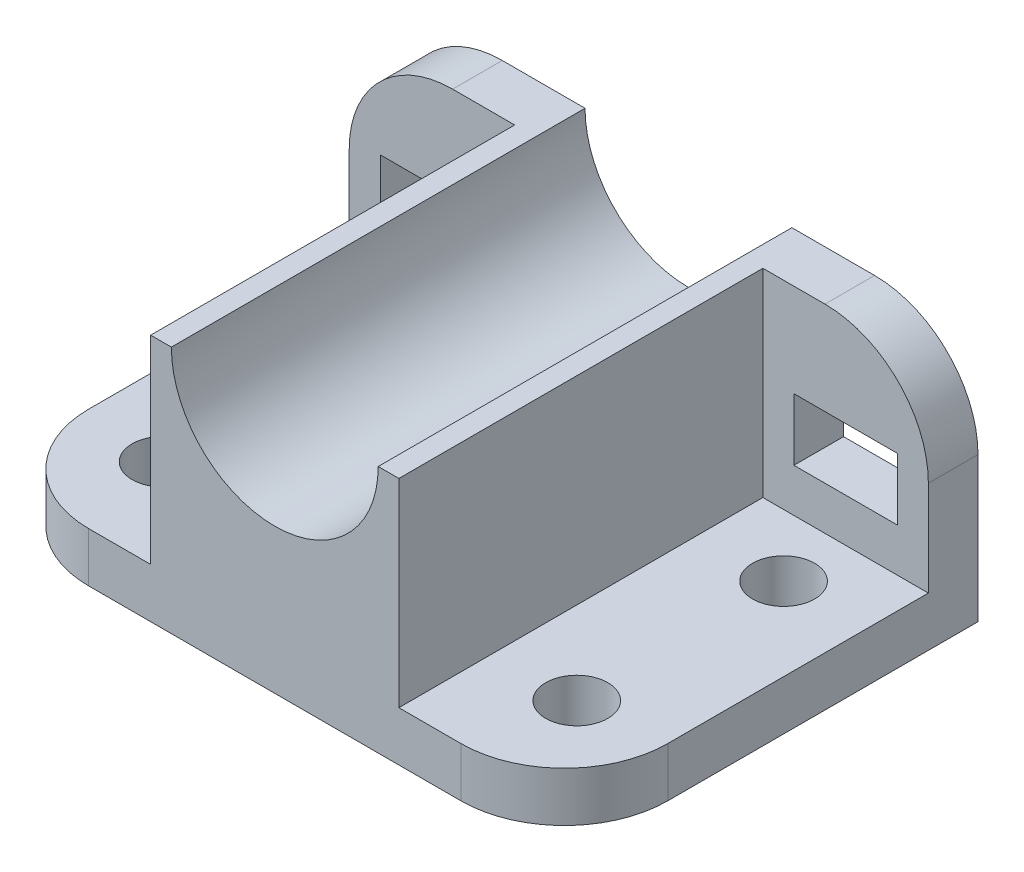
ISO-10303-21;
HEADER;
FILE_DESCRIPTION(('STEP AP214'),'2;1');
FILE_NAME('part.step','',(''),(''),'','','');
FILE_SCHEMA(('AUTOMOTIVE_DESIGN { 1 0 10303 214 1 1 1 1 }'));
ENDSEC;
DATA;
#1=APPLICATION_CONTEXT('core data for automotive mechanical design processes');
#2=APPLICATION_PROTOCOL_DEFINITION('international standard','automotive_design',2000,#1);
#3=PRODUCT_CONTEXT('',#1,'mechanical');
#4=PRODUCT('Part','Part','',(#3));
#5=PRODUCT_RELATED_PRODUCT_CATEGORY('part','',(#4));
#6=PRODUCT_DEFINITION_FORMATION('','',#4);
#7=PRODUCT_DEFINITION_CONTEXT('part definition',#1,'design');
#8=PRODUCT_DEFINITION('design','',#6,#7);
#9=PRODUCT_DEFINITION_SHAPE('','',#8);
#10=(LENGTH_UNIT() NAMED_UNIT(*) SI_UNIT(.MILLI.,.METRE.));
#11=(NAMED_UNIT(*) PLANE_ANGLE_UNIT() SI_UNIT($,.RADIAN.));
#12=(NAMED_UNIT(*) SI_UNIT($,.STERADIAN.) SOLID_ANGLE_UNIT());
#13=UNCERTAINTY_MEASURE_WITH_UNIT(LENGTH_MEASURE(1.E-05),#10,'distance_accuracy_value','');
#14=(GEOMETRIC_REPRESENTATION_CONTEXT(3) GLOBAL_UNCERTAINTY_ASSIGNED_CONTEXT((#13)) GLOBAL_UNIT_ASSIGNED_CONTEXT((#10,
#11,#12)) REPRESENTATION_CONTEXT('',''));
#15=CARTESIAN_POINT('',(0.,0.,0.));
#16=DIRECTION('',(0.,0.,1.));
#17=DIRECTION('',(1.,0.,0.));
#18=AXIS2_PLACEMENT_3D('',#15,#16,#17);
#19=CARTESIAN_POINT('',(0.,60.,100.));
#20=DIRECTION('',(0.,0.,1.));
#21=DIRECTION('',(1.,0.,0.));
#22=AXIS2_PLACEMENT_3D('',#19,#20,#21);
#23=PLANE('',#22);
#24=DIRECTION('',(1.,0.,0.));
#25=VECTOR('',#24,1.);
#26=CARTESIAN_POINT('',(0.,12.,100.));
#27=LINE('',#26,#25);
#28=CARTESIAN_POINT('',(-45.,12.,100.));
#29=VERTEX_POINT('',#28);
#30=CARTESIAN_POINT('',(-30.,12.,100.));
#31=VERTEX_POINT('',#30);
#32=EDGE_CURVE('E372',#29,#31,#27,.T.);
#33=ORIENTED_EDGE('',*,*,#32,.F.);
#34=DIRECTION('',(0.,-1.,0.));
#35=VECTOR('',#34,1.);
#36=CARTESIAN_POINT('',(-45.,0.,100.));
#37=LINE('',#36,#35);
#38=CARTESIAN_POINT('',(-45.,0.,100.));
#39=VERTEX_POINT('',#38);
#40=EDGE_CURVE('E284',#29,#39,#37,.T.);
#41=ORIENTED_EDGE('',*,*,#40,.T.);
#42=DIRECTION('',(1.,0.,0.));
#43=VECTOR('',#42,1.);
#44=CARTESIAN_POINT('',(-70.,0.,100.));
#45=LINE('',#44,#43);
#46=CARTESIAN_POINT('',(45.,0.,100.));
#47=VERTEX_POINT('',#46);
#48=EDGE_CURVE('E247',#39,#47,#45,.T.);
#49=ORIENTED_EDGE('',*,*,#48,.T.);
#50=DIRECTION('',(0.,1.,0.));
#51=VECTOR('',#50,1.);
#52=CARTESIAN_POINT('',(45.,12.,100.));
#53=LINE('',#52,#51);
#54=CARTESIAN_POINT('',(45.,12.,100.));
#55=VERTEX_POINT('',#54);
#56=EDGE_CURVE('E281',#47,#55,#53,.T.);
#57=ORIENTED_EDGE('',*,*,#56,.T.);
#58=DIRECTION('',(-1.,0.,0.));
#59=VECTOR('',#58,1.);
#60=CARTESIAN_POINT('',(0.,12.,100.));
#61=LINE('',#60,#59);
#62=CARTESIAN_POINT('',(30.,12.,100.));
#63=VERTEX_POINT('',#62);
#64=EDGE_CURVE('E399',#55,#63,#61,.T.);
#65=ORIENTED_EDGE('',*,*,#64,.T.);
#66=DIRECTION('',(0.,1.,0.));
#67=VECTOR('',#66,1.);
#68=CARTESIAN_POINT('',(30.,0.,100.));
#69=LINE('',#68,#67);
#70=CARTESIAN_POINT('',(30.,60.,100.));
#71=VERTEX_POINT('',#70);
#72=EDGE_CURVE('E387',#63,#71,#69,.T.);
#73=ORIENTED_EDGE('',*,*,#72,.T.);
#74=DIRECTION('',(-1.,0.,0.));
#75=VECTOR('',#74,1.);
#76=CARTESIAN_POINT('',(70.,60.,100.));
#77=LINE('',#76,#75);
#78=CARTESIAN_POINT('',(25.,60.,100.));
#79=VERTEX_POINT('',#78);
#80=EDGE_CURVE('E250',#71,#79,#77,.T.);
#81=ORIENTED_EDGE('',*,*,#80,.T.);
#82=CARTESIAN_POINT('',(0.,60.,100.));
#83=DIRECTION('',(0.,0.,-1.));
#84=DIRECTION('',(1.,0.,0.));
#85=AXIS2_PLACEMENT_3D('',#82,#83,#84);
#86=CIRCLE('',#85,25.);
#87=CARTESIAN_POINT('',(-25.,60.,100.));
#88=VERTEX_POINT('',#87);
#89=EDGE_CURVE('E253',#79,#88,#86,.T.);
#90=ORIENTED_EDGE('',*,*,#89,.T.);
#91=DIRECTION('',(-1.,0.,0.));
#92=VECTOR('',#91,1.);
#93=CARTESIAN_POINT('',(-25.,60.,100.));
#94=LINE('',#93,#92);
#95=CARTESIAN_POINT('',(-30.,60.,100.));
#96=VERTEX_POINT('',#95);
#97=EDGE_CURVE('E255',#88,#96,#94,.T.);
#98=ORIENTED_EDGE('',*,*,#97,.T.);
#99=DIRECTION('',(0.,1.,0.));
#100=VECTOR('',#99,1.);
#101=CARTESIAN_POINT('',(-30.,0.,100.));
#102=LINE('',#101,#100);
#103=EDGE_CURVE('E204',#31,#96,#102,.T.);
#104=ORIENTED_EDGE('',*,*,#103,.F.);
#105=EDGE_LOOP('',(#33,#41,#49,#57,#65,#73,#81,#90,#98,#104));
#106=FACE_BOUND('',#105,.T.);
#107=ADVANCED_FACE('F33',(#106),#23,.T.);
#108=CARTESIAN_POINT('',(70.,0.,100.));
#109=DIRECTION('',(-1.,0.,0.));
#110=DIRECTION('',(0.,0.,1.));
#111=AXIS2_PLACEMENT_3D('',#108,#109,#110);
#112=PLANE('',#111);
#113=DIRECTION('',(0.,0.,1.));
#114=VECTOR('',#113,1.);
#115=CARTESIAN_POINT('',(70.,12.,12.));
#116=LINE('',#115,#114);
#117=CARTESIAN_POINT('',(70.,12.,12.));
#118=VERTEX_POINT('',#117);
#119=CARTESIAN_POINT('',(70.,12.,75.));
#120=VERTEX_POINT('',#119);
#121=EDGE_CURVE('E398',#118,#120,#116,.T.);
#122=ORIENTED_EDGE('',*,*,#121,.T.);
#123=DIRECTION('',(0.,1.,0.));
#124=VECTOR('',#123,1.);
#125=CARTESIAN_POINT('',(70.,0.,75.));
#126=LINE('',#125,#124);
#127=CARTESIAN_POINT('',(70.,0.,75.));
#128=VERTEX_POINT('',#127);
#129=EDGE_CURVE('E302',#120,#128,#126,.F.);
#130=ORIENTED_EDGE('',*,*,#129,.T.);
#131=DIRECTION('',(0.,0.,-1.));
#132=VECTOR('',#131,1.);
#133=CARTESIAN_POINT('',(70.,0.,100.));
#134=LINE('',#133,#132);
#135=CARTESIAN_POINT('',(70.,0.,0.));
#136=VERTEX_POINT('',#135);
#137=EDGE_CURVE('E276',#128,#136,#134,.T.);
#138=ORIENTED_EDGE('',*,*,#137,.T.);
#139=DIRECTION('',(0.,1.,0.));
#140=VECTOR('',#139,1.);
#141=CARTESIAN_POINT('',(70.,0.,0.));
#142=LINE('',#141,#140);
#143=CARTESIAN_POINT('',(70.,35.,0.));
#144=VERTEX_POINT('',#143);
#145=EDGE_CURVE('E263',#136,#144,#142,.T.);
#146=ORIENTED_EDGE('',*,*,#145,.T.);
#147=DIRECTION('',(0.,0.,-1.));
#148=VECTOR('',#147,1.);
#149=CARTESIAN_POINT('',(70.,35.,100.));
#150=LINE('',#149,#148);
#151=CARTESIAN_POINT('',(70.,35.,12.));
#152=VERTEX_POINT('',#151);
#153=EDGE_CURVE('E300',#144,#152,#150,.F.);
#154=ORIENTED_EDGE('',*,*,#153,.T.);
#155=DIRECTION('',(0.,1.,0.));
#156=VECTOR('',#155,1.);
#157=CARTESIAN_POINT('',(70.,0.,12.));
#158=LINE('',#157,#156);
#159=EDGE_CURVE('E321',#118,#152,#158,.T.);
#160=ORIENTED_EDGE('',*,*,#159,.F.);
#161=EDGE_LOOP('',(#122,#130,#138,#146,#154,#160));
#162=FACE_BOUND('',#161,.T.);
#163=ADVANCED_FACE('F341',(#162),#112,.F.);
#164=CARTESIAN_POINT('',(70.,60.,100.));
#165=DIRECTION('',(0.,-1.,0.));
#166=DIRECTION('',(1.,0.,0.));
#167=AXIS2_PLACEMENT_3D('',#164,#165,#166);
#168=PLANE('',#167);
#169=DIRECTION('',(-1.,0.,0.));
#170=VECTOR('',#169,1.);
#171=CARTESIAN_POINT('',(0.,60.,12.));
#172=LINE('',#171,#170);
#173=CARTESIAN_POINT('',(45.,60.,12.));
#174=VERTEX_POINT('',#173);
#175=CARTESIAN_POINT('',(30.,60.,12.));
#176=VERTEX_POINT('',#175);
#177=EDGE_CURVE('E317',#174,#176,#172,.T.);
#178=ORIENTED_EDGE('',*,*,#177,.F.);
#179=DIRECTION('',(0.,0.,-1.));
#180=VECTOR('',#179,1.);
#181=CARTESIAN_POINT('',(45.,60.,100.));
#182=LINE('',#181,#180);
#183=CARTESIAN_POINT('',(45.,60.,0.));
#184=VERTEX_POINT('',#183);
#185=EDGE_CURVE('E304',#174,#184,#182,.T.);
#186=ORIENTED_EDGE('',*,*,#185,.T.);
#187=DIRECTION('',(-1.,0.,0.));
#188=VECTOR('',#187,1.);
#189=CARTESIAN_POINT('',(70.,60.,0.));
#190=LINE('',#189,#188);
#191=CARTESIAN_POINT('',(25.,60.,0.));
#192=VERTEX_POINT('',#191);
#193=EDGE_CURVE('E266',#184,#192,#190,.T.);
#194=ORIENTED_EDGE('',*,*,#193,.T.);
#195=DIRECTION('',(0.,0.,-1.));
#196=VECTOR('',#195,1.);
#197=CARTESIAN_POINT('',(25.,60.,100.));
#198=LINE('',#197,#196);
#199=EDGE_CURVE('E273',#79,#192,#198,.T.);
#200=ORIENTED_EDGE('',*,*,#199,.F.);
#201=ORIENTED_EDGE('',*,*,#80,.F.);
#202=DIRECTION('',(0.,0.,1.));
#203=VECTOR('',#202,1.);
#204=CARTESIAN_POINT('',(30.,60.,12.));
#205=LINE('',#204,#203);
#206=EDGE_CURVE('E330',#176,#71,#205,.T.);
#207=ORIENTED_EDGE('',*,*,#206,.F.);
#208=EDGE_LOOP('',(#178,#186,#194,#200,#201,#207));
#209=FACE_BOUND('',#208,.T.);
#210=ADVANCED_FACE('F327',(#209),#168,.F.);
#211=CARTESIAN_POINT('',(37.5,22.5,100.));
#212=DIRECTION('',(1.,0.,0.));
#213=DIRECTION('',(0.,0.,-1.));
#214=AXIS2_PLACEMENT_3D('',#211,#212,#213);
#215=PLANE('',#214);
#216=DIRECTION('',(0.,0.,-1.));
#217=VECTOR('',#216,1.);
#218=CARTESIAN_POINT('',(37.5,37.5,100.));
#219=LINE('',#218,#217);
#220=CARTESIAN_POINT('',(37.5,37.5,12.));
#221=VERTEX_POINT('',#220);
#222=CARTESIAN_POINT('',(37.5,37.5,0.));
#223=VERTEX_POINT('',#222);
#224=EDGE_CURVE('E238',#221,#223,#219,.T.);
#225=ORIENTED_EDGE('',*,*,#224,.F.);
#226=DIRECTION('',(0.,1.,0.));
#227=VECTOR('',#226,1.);
#228=CARTESIAN_POINT('',(37.5,0.,12.));
#229=LINE('',#228,#227);
#230=CARTESIAN_POINT('',(37.5,22.5,12.));
#231=VERTEX_POINT('',#230);
#232=EDGE_CURVE('E394',#231,#221,#229,.T.);
#233=ORIENTED_EDGE('',*,*,#232,.F.);
#234=DIRECTION('',(0.,0.,-1.));
#235=VECTOR('',#234,1.);
#236=CARTESIAN_POINT('',(37.5,22.5,100.));
#237=LINE('',#236,#235);
#238=CARTESIAN_POINT('',(37.5,22.5,0.));
#239=VERTEX_POINT('',#238);
#240=EDGE_CURVE('E244',#231,#239,#237,.T.);
#241=ORIENTED_EDGE('',*,*,#240,.T.);
#242=DIRECTION('',(0.,-1.,0.));
#243=VECTOR('',#242,1.);
#244=CARTESIAN_POINT('',(37.5,22.5,0.));
#245=LINE('',#244,#243);
#246=EDGE_CURVE('E221',#223,#239,#245,.T.);
#247=ORIENTED_EDGE('',*,*,#246,.F.);
#248=EDGE_LOOP('',(#225,#233,#241,#247));
#249=FACE_BOUND('',#248,.T.);
#250=ADVANCED_FACE('F441',(#249),#215,.T.);
#251=CARTESIAN_POINT('',(62.5,22.5,100.));
#252=DIRECTION('',(0.,1.,0.));
#253=DIRECTION('',(0.,0.,1.));
#254=AXIS2_PLACEMENT_3D('',#251,#252,#253);
#255=PLANE('',#254);
#256=ORIENTED_EDGE('',*,*,#240,.F.);
#257=DIRECTION('',(-1.,0.,0.));
#258=VECTOR('',#257,1.);
#259=CARTESIAN_POINT('',(0.,22.5,12.));
#260=LINE('',#259,#258);
#261=CARTESIAN_POINT('',(62.5000000000001,22.5,12.));
#262=VERTEX_POINT('',#261);
#263=EDGE_CURVE('E392',#262,#231,#260,.T.);
#264=ORIENTED_EDGE('',*,*,#263,.F.);
#265=DIRECTION('',(0.,0.,-1.));
#266=VECTOR('',#265,1.);
#267=CARTESIAN_POINT('',(62.5,22.5,100.));
#268=LINE('',#267,#266);
#269=CARTESIAN_POINT('',(62.5,22.5,0.));
#270=VERTEX_POINT('',#269);
#271=EDGE_CURVE('E242',#262,#270,#268,.T.);
#272=ORIENTED_EDGE('',*,*,#271,.T.);
#273=DIRECTION('',(1.,0.,0.));
#274=VECTOR('',#273,1.);
#275=CARTESIAN_POINT('',(62.5,22.5,0.));
#276=LINE('',#275,#274);
#277=EDGE_CURVE('E229',#239,#270,#276,.T.);
#278=ORIENTED_EDGE('',*,*,#277,.F.);
#279=EDGE_LOOP('',(#256,#264,#272,#278));
#280=FACE_BOUND('',#279,.T.);
#281=ADVANCED_FACE('F444',(#280),#255,.T.);
#282=CARTESIAN_POINT('',(62.5,22.5,100.));
#283=DIRECTION('',(-1.,0.,0.));
#284=DIRECTION('',(0.,-1.,0.));
#285=AXIS2_PLACEMENT_3D('',#282,#283,#284);
#286=PLANE('',#285);
#287=ORIENTED_EDGE('',*,*,#271,.F.);
#288=DIRECTION('',(0.,-1.,0.));
#289=VECTOR('',#288,1.);
#290=CARTESIAN_POINT('',(62.5000000000001,0.,12.));
#291=LINE('',#290,#289);
#292=CARTESIAN_POINT('',(62.5,37.5,12.));
#293=VERTEX_POINT('',#292);
#294=EDGE_CURVE('E390',#293,#262,#291,.T.);
#295=ORIENTED_EDGE('',*,*,#294,.F.);
#296=DIRECTION('',(0.,0.,-1.));
#297=VECTOR('',#296,1.);
#298=CARTESIAN_POINT('',(62.5,37.5,100.));
#299=LINE('',#298,#297);
#300=CARTESIAN_POINT('',(62.5,37.5,0.));
#301=VERTEX_POINT('',#300);
#302=EDGE_CURVE('E240',#293,#301,#299,.T.);
#303=ORIENTED_EDGE('',*,*,#302,.T.);
#304=DIRECTION('',(0.,1.,0.));
#305=VECTOR('',#304,1.);
#306=CARTESIAN_POINT('',(62.5,22.5,0.));
#307=LINE('',#306,#305);
#308=EDGE_CURVE('E232',#270,#301,#307,.T.);
#309=ORIENTED_EDGE('',*,*,#308,.F.);
#310=EDGE_LOOP('',(#287,#295,#303,#309));
#311=FACE_BOUND('',#310,.T.);
#312=ADVANCED_FACE('F448',(#311),#286,.T.);
#313=CARTESIAN_POINT('',(62.5,37.5,100.));
#314=DIRECTION('',(0.,-1.,0.));
#315=DIRECTION('',(1.,0.,0.));
#316=AXIS2_PLACEMENT_3D('',#313,#314,#315);
#317=PLANE('',#316);
#318=ORIENTED_EDGE('',*,*,#302,.F.);
#319=DIRECTION('',(1.,0.,0.));
#320=VECTOR('',#319,1.);
#321=CARTESIAN_POINT('',(0.,37.5,12.));
#322=LINE('',#321,#320);
#323=EDGE_CURVE('E396',#221,#293,#322,.T.);
#324=ORIENTED_EDGE('',*,*,#323,.F.);
#325=ORIENTED_EDGE('',*,*,#224,.T.);
#326=DIRECTION('',(-1.,0.,0.));
#327=VECTOR('',#326,1.);
#328=CARTESIAN_POINT('',(62.5,37.5,0.));
#329=LINE('',#328,#327);
#330=EDGE_CURVE('E235',#301,#223,#329,.T.);
#331=ORIENTED_EDGE('',*,*,#330,.F.);
#332=EDGE_LOOP('',(#318,#324,#325,#331));
#333=FACE_BOUND('',#332,.T.);
#334=ADVANCED_FACE('F452',(#333),#317,.T.);
#335=CARTESIAN_POINT('',(-62.5,22.5,100.));
#336=DIRECTION('',(1.,0.,0.));
#337=DIRECTION('',(0.,1.,0.));
#338=AXIS2_PLACEMENT_3D('',#335,#336,#337);
#339=PLANE('',#338);
#340=DIRECTION('',(0.,0.,-1.));
#341=VECTOR('',#340,1.);
#342=CARTESIAN_POINT('',(-62.5,37.5,100.));
#343=LINE('',#342,#341);
#344=CARTESIAN_POINT('',(-62.5,37.5,12.));
#345=VERTEX_POINT('',#344);
#346=CARTESIAN_POINT('',(-62.5,37.5,0.));
#347=VERTEX_POINT('',#346);
#348=EDGE_CURVE('E223',#345,#347,#343,.T.);
#349=ORIENTED_EDGE('',*,*,#348,.F.);
#350=DIRECTION('',(0.,1.,0.));
#351=VECTOR('',#350,1.);
#352=CARTESIAN_POINT('',(-62.5,0.,12.));
#353=LINE('',#352,#351);
#354=CARTESIAN_POINT('',(-62.5,22.5,12.));
#355=VERTEX_POINT('',#354);
#356=EDGE_CURVE('E213',#355,#345,#353,.T.);
#357=ORIENTED_EDGE('',*,*,#356,.F.);
#358=DIRECTION('',(0.,0.,-1.));
#359=VECTOR('',#358,1.);
#360=CARTESIAN_POINT('',(-62.5,22.5,100.));
#361=LINE('',#360,#359);
#362=CARTESIAN_POINT('',(-62.5,22.5,0.));
#363=VERTEX_POINT('',#362);
#364=EDGE_CURVE('E212',#355,#363,#361,.T.);
#365=ORIENTED_EDGE('',*,*,#364,.T.);
#366=DIRECTION('',(0.,-1.,0.));
#367=VECTOR('',#366,1.);
#368=CARTESIAN_POINT('',(-62.5,22.5,0.));
#369=LINE('',#368,#367);
#370=EDGE_CURVE('E379',#347,#363,#369,.T.);
#371=ORIENTED_EDGE('',*,*,#370,.F.);
#372=EDGE_LOOP('',(#349,#357,#365,#371));
#373=FACE_BOUND('',#372,.T.);
#374=ADVANCED_FACE('F421',(#373),#339,.T.);
#375=CARTESIAN_POINT('',(-37.5,22.5,100.));
#376=DIRECTION('',(0.,1.,0.));
#377=DIRECTION('',(-1.,0.,0.));
#378=AXIS2_PLACEMENT_3D('',#375,#376,#377);
#379=PLANE('',#378);
#380=ORIENTED_EDGE('',*,*,#364,.F.);
#381=DIRECTION('',(-1.,0.,0.));
#382=VECTOR('',#381,1.);
#383=CARTESIAN_POINT('',(0.,22.5,12.));
#384=LINE('',#383,#382);
#385=CARTESIAN_POINT('',(-37.5,22.5,12.));
#386=VERTEX_POINT('',#385);
#387=EDGE_CURVE('E197',#386,#355,#384,.T.);
#388=ORIENTED_EDGE('',*,*,#387,.F.);
#389=DIRECTION('',(0.,0.,-1.));
#390=VECTOR('',#389,1.);
#391=CARTESIAN_POINT('',(-37.5,22.5,100.));
#392=LINE('',#391,#390);
#393=CARTESIAN_POINT('',(-37.5,22.5,0.));
#394=VERTEX_POINT('',#393);
#395=EDGE_CURVE('E210',#386,#394,#392,.T.);
#396=ORIENTED_EDGE('',*,*,#395,.T.);
#397=DIRECTION('',(1.,0.,0.));
#398=VECTOR('',#397,1.);
#399=CARTESIAN_POINT('',(-37.5,22.5,0.));
#400=LINE('',#399,#398);
#401=EDGE_CURVE('E410',#363,#394,#400,.T.);
#402=ORIENTED_EDGE('',*,*,#401,.F.);
#403=EDGE_LOOP('',(#380,#388,#396,#402));
#404=FACE_BOUND('',#403,.T.);
#405=ADVANCED_FACE('F208',(#404),#379,.T.);
#406=CARTESIAN_POINT('',(-37.5,22.5,100.));
#407=DIRECTION('',(-1.,0.,0.));
#408=DIRECTION('',(0.,0.,1.));
#409=AXIS2_PLACEMENT_3D('',#406,#407,#408);
#410=PLANE('',#409);
#411=ORIENTED_EDGE('',*,*,#395,.F.);
#412=DIRECTION('',(0.,-1.,0.));
#413=VECTOR('',#412,1.);
#414=CARTESIAN_POINT('',(-37.5,0.,12.));
#415=LINE('',#414,#413);
#416=CARTESIAN_POINT('',(-37.5,37.5,12.));
#417=VERTEX_POINT('',#416);
#418=EDGE_CURVE('E193',#417,#386,#415,.T.);
#419=ORIENTED_EDGE('',*,*,#418,.F.);
#420=DIRECTION('',(0.,0.,-1.));
#421=VECTOR('',#420,1.);
#422=CARTESIAN_POINT('',(-37.5,37.5,100.));
#423=LINE('',#422,#421);
#424=CARTESIAN_POINT('',(-37.5,37.5,0.));
#425=VERTEX_POINT('',#424);
#426=EDGE_CURVE('E219',#417,#425,#423,.T.);
#427=ORIENTED_EDGE('',*,*,#426,.T.);
#428=DIRECTION('',(0.,1.,0.));
#429=VECTOR('',#428,1.);
#430=CARTESIAN_POINT('',(-37.5,22.5,0.));
#431=LINE('',#430,#429);
#432=EDGE_CURVE('E217',#394,#425,#431,.T.);
#433=ORIENTED_EDGE('',*,*,#432,.F.);
#434=EDGE_LOOP('',(#411,#419,#427,#433));
#435=FACE_BOUND('',#434,.T.);
#436=ADVANCED_FACE('F215',(#435),#410,.T.);
#437=CARTESIAN_POINT('',(-37.5,37.5,100.));
#438=DIRECTION('',(0.,-1.,0.));
#439=DIRECTION('',(1.,0.,0.));
#440=AXIS2_PLACEMENT_3D('',#437,#438,#439);
#441=PLANE('',#440);
#442=ORIENTED_EDGE('',*,*,#426,.F.);
#443=DIRECTION('',(1.,0.,0.));
#444=VECTOR('',#443,1.);
#445=CARTESIAN_POINT('',(0.,37.5,12.));
#446=LINE('',#445,#444);
#447=EDGE_CURVE('E200',#345,#417,#446,.T.);
#448=ORIENTED_EDGE('',*,*,#447,.F.);
#449=ORIENTED_EDGE('',*,*,#348,.T.);
#450=DIRECTION('',(-1.,0.,0.));
#451=VECTOR('',#450,1.);
#452=CARTESIAN_POINT('',(-37.5,37.5,0.));
#453=LINE('',#452,#451);
#454=EDGE_CURVE('E413',#425,#347,#453,.T.);
#455=ORIENTED_EDGE('',*,*,#454,.F.);
#456=EDGE_LOOP('',(#442,#448,#449,#455));
#457=FACE_BOUND('',#456,.T.);
#458=ADVANCED_FACE('F419',(#457),#441,.T.);
#459=CARTESIAN_POINT('',(0.,60.,0.));
#460=DIRECTION('',(0.,0.,1.));
#461=DIRECTION('',(1.,0.,0.));
#462=AXIS2_PLACEMENT_3D('',#459,#460,#461);
#463=PLANE('',#462);
#464=ORIENTED_EDGE('',*,*,#246,.T.);
#465=ORIENTED_EDGE('',*,*,#277,.T.);
#466=ORIENTED_EDGE('',*,*,#308,.T.);
#467=ORIENTED_EDGE('',*,*,#330,.T.);
#468=EDGE_LOOP('',(#464,#465,#466,#467));
#469=FACE_BOUND('',#468,.T.);
#470=ORIENTED_EDGE('',*,*,#193,.F.);
#471=CARTESIAN_POINT('',(45.,35.,0.));
#472=DIRECTION('',(0.,0.,1.));
#473=DIRECTION('',(1.,0.,0.));
#474=AXIS2_PLACEMENT_3D('',#471,#472,#473);
#475=CIRCLE('',#474,25.);
#476=EDGE_CURVE('E308',#184,#144,#475,.F.);
#477=ORIENTED_EDGE('',*,*,#476,.T.);
#478=ORIENTED_EDGE('',*,*,#145,.F.);
#479=DIRECTION('',(1.,0.,0.));
#480=VECTOR('',#479,1.);
#481=CARTESIAN_POINT('',(-70.,0.,0.));
#482=LINE('',#481,#480);
#483=CARTESIAN_POINT('',(-70.,0.,0.));
#484=VERTEX_POINT('',#483);
#485=EDGE_CURVE('E260',#484,#136,#482,.T.);
#486=ORIENTED_EDGE('',*,*,#485,.F.);
#487=DIRECTION('',(0.,-1.,0.));
#488=VECTOR('',#487,1.);
#489=CARTESIAN_POINT('',(-70.,60.,0.));
#490=LINE('',#489,#488);
#491=CARTESIAN_POINT('',(-70.,35.,0.));
#492=VERTEX_POINT('',#491);
#493=EDGE_CURVE('E246',#492,#484,#490,.T.);
#494=ORIENTED_EDGE('',*,*,#493,.F.);
#495=CARTESIAN_POINT('',(-45.,35.,0.));
#496=DIRECTION('',(0.,0.,1.));
#497=DIRECTION('',(1.,0.,0.));
#498=AXIS2_PLACEMENT_3D('',#495,#496,#497);
#499=CIRCLE('',#498,25.);
#500=CARTESIAN_POINT('',(-45.,60.,0.));
#501=VERTEX_POINT('',#500);
#502=EDGE_CURVE('E55',#492,#501,#499,.F.);
#503=ORIENTED_EDGE('',*,*,#502,.T.);
#504=DIRECTION('',(-1.,0.,0.));
#505=VECTOR('',#504,1.);
#506=CARTESIAN_POINT('',(-25.,60.,0.));
#507=LINE('',#506,#505);
#508=CARTESIAN_POINT('',(-25.,60.,0.));
#509=VERTEX_POINT('',#508);
#510=EDGE_CURVE('E251',#509,#501,#507,.T.);
#511=ORIENTED_EDGE('',*,*,#510,.F.);
#512=CARTESIAN_POINT('',(0.,60.,0.));
#513=DIRECTION('',(0.,0.,-1.));
#514=DIRECTION('',(1.,0.,0.));
#515=AXIS2_PLACEMENT_3D('',#512,#513,#514);
#516=CIRCLE('',#515,25.);
#517=EDGE_CURVE('E268',#192,#509,#516,.T.);
#518=ORIENTED_EDGE('',*,*,#517,.F.);
#519=EDGE_LOOP('',(#470,#477,#478,#486,#494,#503,#511,#518));
#520=FACE_BOUND('',#519,.T.);
#521=ORIENTED_EDGE('',*,*,#370,.T.);
#522=ORIENTED_EDGE('',*,*,#401,.T.);
#523=ORIENTED_EDGE('',*,*,#432,.T.);
#524=ORIENTED_EDGE('',*,*,#454,.T.);
#525=EDGE_LOOP('',(#521,#522,#523,#524));
#526=FACE_BOUND('',#525,.T.);
#527=ADVANCED_FACE('F335',(#469,#520,#526),#463,.F.);
#528=CARTESIAN_POINT('',(-70.,60.,100.));
#529=DIRECTION('',(1.,0.,0.));
#530=DIRECTION('',(0.,1.,0.));
#531=AXIS2_PLACEMENT_3D('',#528,#529,#530);
#532=PLANE('',#531);
#533=DIRECTION('',(0.,0.,-1.));
#534=VECTOR('',#533,1.);
#535=CARTESIAN_POINT('',(-70.,0.,100.));
#536=LINE('',#535,#534);
#537=CARTESIAN_POINT('',(-70.,0.,75.));
#538=VERTEX_POINT('',#537);
#539=EDGE_CURVE('E278',#538,#484,#536,.T.);
#540=ORIENTED_EDGE('',*,*,#539,.F.);
#541=DIRECTION('',(0.,-1.,0.));
#542=VECTOR('',#541,1.);
#543=CARTESIAN_POINT('',(-70.,12.,75.));
#544=LINE('',#543,#542);
#545=CARTESIAN_POINT('',(-70.,12.,75.));
#546=VERTEX_POINT('',#545);
#547=EDGE_CURVE('E294',#538,#546,#544,.F.);
#548=ORIENTED_EDGE('',*,*,#547,.T.);
#549=DIRECTION('',(0.,0.,1.));
#550=VECTOR('',#549,1.);
#551=CARTESIAN_POINT('',(-70.,12.,12.));
#552=LINE('',#551,#550);
#553=CARTESIAN_POINT('',(-70.,12.,12.));
#554=VERTEX_POINT('',#553);
#555=EDGE_CURVE('E376',#554,#546,#552,.T.);
#556=ORIENTED_EDGE('',*,*,#555,.F.);
#557=DIRECTION('',(0.,-1.,0.));
#558=VECTOR('',#557,1.);
#559=CARTESIAN_POINT('',(-70.,0.,12.));
#560=LINE('',#559,#558);
#561=CARTESIAN_POINT('',(-70.,35.,12.));
#562=VERTEX_POINT('',#561);
#563=EDGE_CURVE('E355',#562,#554,#560,.T.);
#564=ORIENTED_EDGE('',*,*,#563,.F.);
#565=DIRECTION('',(0.,0.,-1.));
#566=VECTOR('',#565,1.);
#567=CARTESIAN_POINT('',(-70.,35.,100.));
#568=LINE('',#567,#566);
#569=EDGE_CURVE('E291',#562,#492,#568,.T.);
#570=ORIENTED_EDGE('',*,*,#569,.T.);
#571=ORIENTED_EDGE('',*,*,#493,.T.);
#572=EDGE_LOOP('',(#540,#548,#556,#564,#570,#571));
#573=FACE_BOUND('',#572,.T.);
#574=ADVANCED_FACE('F350',(#573),#532,.F.);
#575=CARTESIAN_POINT('',(-70.,0.,100.));
#576=DIRECTION('',(0.,1.,0.));
#577=DIRECTION('',(-1.,0.,0.));
#578=AXIS2_PLACEMENT_3D('',#575,#576,#577);
#579=PLANE('',#578);
#580=CARTESIAN_POINT('',(-50.,0.,27.));
#581=DIRECTION('',(0.,1.,0.));
#582=DIRECTION('',(0.,0.,1.));
#583=AXIS2_PLACEMENT_3D('',#580,#581,#582);
#584=CIRCLE('',#583,7.49999999999999);
#585=CARTESIAN_POINT('',(-50.,0.,34.5));
#586=VERTEX_POINT('',#585);
#587=EDGE_CURVE('E509',#586,#586,#584,.T.);
#588=ORIENTED_EDGE('',*,*,#587,.T.);
#589=EDGE_LOOP('',(#588));
#590=FACE_BOUND('',#589,.T.);
#591=CARTESIAN_POINT('',(-50.,0.,77.));
#592=DIRECTION('',(0.,1.,0.));
#593=DIRECTION('',(0.,0.,1.));
#594=AXIS2_PLACEMENT_3D('',#591,#592,#593);
#595=CIRCLE('',#594,7.49999999999999);
#596=CARTESIAN_POINT('',(-50.,0.,84.5));
#597=VERTEX_POINT('',#596);
#598=EDGE_CURVE('E519',#597,#597,#595,.T.);
#599=ORIENTED_EDGE('',*,*,#598,.T.);
#600=EDGE_LOOP('',(#599));
#601=FACE_BOUND('',#600,.T.);
#602=CARTESIAN_POINT('',(50.,0.,77.));
#603=DIRECTION('',(0.,1.,0.));
#604=DIRECTION('',(0.,0.,1.));
#605=AXIS2_PLACEMENT_3D('',#602,#603,#604);
#606=CIRCLE('',#605,7.49999999999999);
#607=CARTESIAN_POINT('',(50.,0.,84.5));
#608=VERTEX_POINT('',#607);
#609=EDGE_CURVE('E525',#608,#608,#606,.T.);
#610=ORIENTED_EDGE('',*,*,#609,.T.);
#611=EDGE_LOOP('',(#610));
#612=FACE_BOUND('',#611,.T.);
#613=CARTESIAN_POINT('',(50.,0.,27.));
#614=DIRECTION('',(0.,1.,0.));
#615=DIRECTION('',(0.,0.,1.));
#616=AXIS2_PLACEMENT_3D('',#613,#614,#615);
#617=CIRCLE('',#616,7.49999999999999);
#618=CARTESIAN_POINT('',(50.,0.,34.5));
#619=VERTEX_POINT('',#618);
#620=EDGE_CURVE('E401',#619,#619,#617,.T.);
#621=ORIENTED_EDGE('',*,*,#620,.T.);
#622=EDGE_LOOP('',(#621));
#623=FACE_BOUND('',#622,.T.);
#624=ORIENTED_EDGE('',*,*,#48,.F.);
#625=CARTESIAN_POINT('',(-45.,0.,75.));
#626=DIRECTION('',(0.,1.,0.));
#627=DIRECTION('',(-1.,0.,0.));
#628=AXIS2_PLACEMENT_3D('',#625,#626,#627);
#629=CIRCLE('',#628,25.);
#630=EDGE_CURVE('E289',#39,#538,#629,.F.);
#631=ORIENTED_EDGE('',*,*,#630,.T.);
#632=ORIENTED_EDGE('',*,*,#539,.T.);
#633=ORIENTED_EDGE('',*,*,#485,.T.);
#634=ORIENTED_EDGE('',*,*,#137,.F.);
#635=CARTESIAN_POINT('',(45.,0.,75.));
#636=DIRECTION('',(0.,1.,0.));
#637=DIRECTION('',(-1.,0.,0.));
#638=AXIS2_PLACEMENT_3D('',#635,#636,#637);
#639=CIRCLE('',#638,25.);
#640=EDGE_CURVE('E287',#128,#47,#639,.F.);
#641=ORIENTED_EDGE('',*,*,#640,.T.);
#642=EDGE_LOOP('',(#624,#631,#632,#633,#634,#641));
#643=FACE_BOUND('',#642,.T.);
#644=ADVANCED_FACE('F347',(#590,#601,#612,#623,#643),#579,.F.);
#645=CARTESIAN_POINT('',(0.,60.,100.));
#646=DIRECTION('',(0.,0.,-1.));
#647=DIRECTION('',(-1.,0.,0.));
#648=AXIS2_PLACEMENT_3D('',#645,#646,#647);
#649=CYLINDRICAL_SURFACE('',#648,25.);
#650=ORIENTED_EDGE('',*,*,#517,.T.);
#651=DIRECTION('',(0.,0.,-1.));
#652=VECTOR('',#651,1.);
#653=CARTESIAN_POINT('',(-25.,60.,100.));
#654=LINE('',#653,#652);
#655=EDGE_CURVE('E258',#88,#509,#654,.T.);
#656=ORIENTED_EDGE('',*,*,#655,.F.);
#657=ORIENTED_EDGE('',*,*,#89,.F.);
#658=ORIENTED_EDGE('',*,*,#199,.T.);
#659=EDGE_LOOP('',(#650,#656,#657,#658));
#660=FACE_BOUND('',#659,.T.);
#661=ADVANCED_FACE('F542',(#660),#649,.F.);
#662=CARTESIAN_POINT('',(-25.,60.,100.));
#663=DIRECTION('',(0.,-1.,0.));
#664=DIRECTION('',(1.,0.,0.));
#665=AXIS2_PLACEMENT_3D('',#662,#663,#664);
#666=PLANE('',#665);
#667=ORIENTED_EDGE('',*,*,#510,.T.);
#668=DIRECTION('',(0.,0.,-1.));
#669=VECTOR('',#668,1.);
#670=CARTESIAN_POINT('',(-45.,60.,100.));
#671=LINE('',#670,#669);
#672=CARTESIAN_POINT('',(-45.,60.,12.));
#673=VERTEX_POINT('',#672);
#674=EDGE_CURVE('E41',#501,#673,#671,.F.);
#675=ORIENTED_EDGE('',*,*,#674,.T.);
#676=DIRECTION('',(-1.,0.,0.));
#677=VECTOR('',#676,1.);
#678=CARTESIAN_POINT('',(0.,60.,12.));
#679=LINE('',#678,#677);
#680=CARTESIAN_POINT('',(-30.,60.,12.));
#681=VERTEX_POINT('',#680);
#682=EDGE_CURVE('E360',#681,#673,#679,.T.);
#683=ORIENTED_EDGE('',*,*,#682,.F.);
#684=DIRECTION('',(0.,0.,1.));
#685=VECTOR('',#684,1.);
#686=CARTESIAN_POINT('',(-30.,60.,12.));
#687=LINE('',#686,#685);
#688=EDGE_CURVE('E380',#681,#96,#687,.T.);
#689=ORIENTED_EDGE('',*,*,#688,.T.);
#690=ORIENTED_EDGE('',*,*,#97,.F.);
#691=ORIENTED_EDGE('',*,*,#655,.T.);
#692=EDGE_LOOP('',(#667,#675,#683,#689,#690,#691));
#693=FACE_BOUND('',#692,.T.);
#694=ADVANCED_FACE('F478',(#693),#666,.F.);
#695=CARTESIAN_POINT('',(0.,12.,12.));
#696=DIRECTION('',(0.,-1.,0.));
#697=DIRECTION('',(0.,0.,-1.));
#698=AXIS2_PLACEMENT_3D('',#695,#696,#697);
#699=PLANE('',#698);
#700=CARTESIAN_POINT('',(-50.,12.,27.));
#701=DIRECTION('',(0.,1.,0.));
#702=DIRECTION('',(0.,0.,1.));
#703=AXIS2_PLACEMENT_3D('',#700,#701,#702);
#704=CIRCLE('',#703,7.49999999999999);
#705=CARTESIAN_POINT('',(-50.,12.,34.5));
#706=VERTEX_POINT('',#705);
#707=EDGE_CURVE('E512',#706,#706,#704,.T.);
#708=ORIENTED_EDGE('',*,*,#707,.F.);
#709=EDGE_LOOP('',(#708));
#710=FACE_BOUND('',#709,.T.);
#711=CARTESIAN_POINT('',(-50.,12.,77.));
#712=DIRECTION('',(0.,1.,0.));
#713=DIRECTION('',(0.,0.,1.));
#714=AXIS2_PLACEMENT_3D('',#711,#712,#713);
#715=CIRCLE('',#714,7.49999999999999);
#716=CARTESIAN_POINT('',(-50.,12.,84.5));
#717=VERTEX_POINT('',#716);
#718=EDGE_CURVE('E514',#717,#717,#715,.T.);
#719=ORIENTED_EDGE('',*,*,#718,.F.);
#720=EDGE_LOOP('',(#719));
#721=FACE_BOUND('',#720,.T.);
#722=ORIENTED_EDGE('',*,*,#555,.T.);
#723=CARTESIAN_POINT('',(-45.,12.,75.));
#724=DIRECTION('',(0.,-1.,0.));
#725=DIRECTION('',(0.,0.,-1.));
#726=AXIS2_PLACEMENT_3D('',#723,#724,#725);
#727=CIRCLE('',#726,25.);
#728=EDGE_CURVE('E296',#546,#29,#727,.F.);
#729=ORIENTED_EDGE('',*,*,#728,.T.);
#730=ORIENTED_EDGE('',*,*,#32,.T.);
#731=DIRECTION('',(0.,0.,1.));
#732=VECTOR('',#731,1.);
#733=CARTESIAN_POINT('',(-30.,12.,12.));
#734=LINE('',#733,#732);
#735=CARTESIAN_POINT('',(-30.,12.,12.));
#736=VERTEX_POINT('',#735);
#737=EDGE_CURVE('E366',#736,#31,#734,.T.);
#738=ORIENTED_EDGE('',*,*,#737,.F.);
#739=DIRECTION('',(1.,0.,0.));
#740=VECTOR('',#739,1.);
#741=CARTESIAN_POINT('',(0.,12.,12.));
#742=LINE('',#741,#740);
#743=EDGE_CURVE('E368',#554,#736,#742,.T.);
#744=ORIENTED_EDGE('',*,*,#743,.F.);
#745=EDGE_LOOP('',(#722,#729,#730,#738,#744));
#746=FACE_BOUND('',#745,.T.);
#747=ADVANCED_FACE('F474',(#710,#721,#746),#699,.F.);
#748=CARTESIAN_POINT('',(-30.,0.,12.));
#749=DIRECTION('',(1.,0.,0.));
#750=DIRECTION('',(0.,1.,0.));
#751=AXIS2_PLACEMENT_3D('',#748,#749,#750);
#752=PLANE('',#751);
#753=ORIENTED_EDGE('',*,*,#103,.T.);
#754=ORIENTED_EDGE('',*,*,#688,.F.);
#755=DIRECTION('',(0.,1.,0.));
#756=VECTOR('',#755,1.);
#757=CARTESIAN_POINT('',(-30.,0.,12.));
#758=LINE('',#757,#756);
#759=EDGE_CURVE('E362',#736,#681,#758,.T.);
#760=ORIENTED_EDGE('',*,*,#759,.F.);
#761=ORIENTED_EDGE('',*,*,#737,.T.);
#762=EDGE_LOOP('',(#753,#754,#760,#761));
#763=FACE_BOUND('',#762,.T.);
#764=ADVANCED_FACE('F477',(#763),#752,.F.);
#765=CARTESIAN_POINT('',(0.,0.,12.));
#766=DIRECTION('',(0.,0.,1.));
#767=DIRECTION('',(1.,0.,0.));
#768=AXIS2_PLACEMENT_3D('',#765,#766,#767);
#769=PLANE('',#768);
#770=ORIENTED_EDGE('',*,*,#418,.T.);
#771=ORIENTED_EDGE('',*,*,#387,.T.);
#772=ORIENTED_EDGE('',*,*,#356,.T.);
#773=ORIENTED_EDGE('',*,*,#447,.T.);
#774=EDGE_LOOP('',(#770,#771,#772,#773));
#775=FACE_BOUND('',#774,.T.);
#776=ORIENTED_EDGE('',*,*,#682,.T.);
#777=CARTESIAN_POINT('',(-45.,35.,12.));
#778=DIRECTION('',(0.,0.,1.));
#779=DIRECTION('',(1.,0.,0.));
#780=AXIS2_PLACEMENT_3D('',#777,#778,#779);
#781=CIRCLE('',#780,25.);
#782=EDGE_CURVE('E11',#673,#562,#781,.T.);
#783=ORIENTED_EDGE('',*,*,#782,.T.);
#784=ORIENTED_EDGE('',*,*,#563,.T.);
#785=ORIENTED_EDGE('',*,*,#743,.T.);
#786=ORIENTED_EDGE('',*,*,#759,.T.);
#787=EDGE_LOOP('',(#776,#783,#784,#785,#786));
#788=FACE_BOUND('',#787,.T.);
#789=ADVANCED_FACE('F195',(#775,#788),#769,.T.);
#790=CARTESIAN_POINT('',(0.,12.,12.));
#791=DIRECTION('',(0.,1.,0.));
#792=DIRECTION('',(0.,0.,1.));
#793=AXIS2_PLACEMENT_3D('',#790,#791,#792);
#794=PLANE('',#793);
#795=CARTESIAN_POINT('',(50.,12.,77.));
#796=DIRECTION('',(0.,1.,0.));
#797=DIRECTION('',(0.,0.,1.));
#798=AXIS2_PLACEMENT_3D('',#795,#796,#797);
#799=CIRCLE('',#798,7.49999999999999);
#800=CARTESIAN_POINT('',(50.,12.,84.5));
#801=VERTEX_POINT('',#800);
#802=EDGE_CURVE('E522',#801,#801,#799,.T.);
#803=ORIENTED_EDGE('',*,*,#802,.F.);
#804=EDGE_LOOP('',(#803));
#805=FACE_BOUND('',#804,.T.);
#806=CARTESIAN_POINT('',(50.,12.,27.));
#807=DIRECTION('',(0.,1.,0.));
#808=DIRECTION('',(0.,0.,1.));
#809=AXIS2_PLACEMENT_3D('',#806,#807,#808);
#810=CIRCLE('',#809,7.49999999999999);
#811=CARTESIAN_POINT('',(50.,12.,34.5));
#812=VERTEX_POINT('',#811);
#813=EDGE_CURVE('E528',#812,#812,#810,.T.);
#814=ORIENTED_EDGE('',*,*,#813,.F.);
#815=EDGE_LOOP('',(#814));
#816=FACE_BOUND('',#815,.T.);
#817=ORIENTED_EDGE('',*,*,#64,.F.);
#818=CARTESIAN_POINT('',(45.,12.,75.));
#819=DIRECTION('',(0.,1.,0.));
#820=DIRECTION('',(0.,0.,1.));
#821=AXIS2_PLACEMENT_3D('',#818,#819,#820);
#822=CIRCLE('',#821,25.);
#823=EDGE_CURVE('E298',#55,#120,#822,.T.);
#824=ORIENTED_EDGE('',*,*,#823,.T.);
#825=ORIENTED_EDGE('',*,*,#121,.F.);
#826=DIRECTION('',(-1.,0.,0.));
#827=VECTOR('',#826,1.);
#828=CARTESIAN_POINT('',(0.,12.,12.));
#829=LINE('',#828,#827);
#830=CARTESIAN_POINT('',(30.,12.,12.));
#831=VERTEX_POINT('',#830);
#832=EDGE_CURVE('E384',#118,#831,#829,.T.);
#833=ORIENTED_EDGE('',*,*,#832,.T.);
#834=DIRECTION('',(0.,0.,1.));
#835=VECTOR('',#834,1.);
#836=CARTESIAN_POINT('',(30.,12.,12.));
#837=LINE('',#836,#835);
#838=EDGE_CURVE('E374',#831,#63,#837,.T.);
#839=ORIENTED_EDGE('',*,*,#838,.T.);
#840=EDGE_LOOP('',(#817,#824,#825,#833,#839));
#841=FACE_BOUND('',#840,.T.);
#842=ADVANCED_FACE('F463',(#805,#816,#841),#794,.T.);
#843=CARTESIAN_POINT('',(30.,0.,12.));
#844=DIRECTION('',(1.,0.,0.));
#845=DIRECTION('',(0.,1.,0.));
#846=AXIS2_PLACEMENT_3D('',#843,#844,#845);
#847=PLANE('',#846);
#848=ORIENTED_EDGE('',*,*,#72,.F.);
#849=ORIENTED_EDGE('',*,*,#838,.F.);
#850=DIRECTION('',(0.,1.,0.));
#851=VECTOR('',#850,1.);
#852=CARTESIAN_POINT('',(30.,0.,12.));
#853=LINE('',#852,#851);
#854=EDGE_CURVE('E331',#831,#176,#853,.T.);
#855=ORIENTED_EDGE('',*,*,#854,.T.);
#856=ORIENTED_EDGE('',*,*,#206,.T.);
#857=EDGE_LOOP('',(#848,#849,#855,#856));
#858=FACE_BOUND('',#857,.T.);
#859=ADVANCED_FACE('F466',(#858),#847,.T.);
#860=CARTESIAN_POINT('',(0.,0.,12.));
#861=DIRECTION('',(0.,0.,1.));
#862=DIRECTION('',(1.,0.,0.));
#863=AXIS2_PLACEMENT_3D('',#860,#861,#862);
#864=PLANE('',#863);
#865=ORIENTED_EDGE('',*,*,#159,.T.);
#866=CARTESIAN_POINT('',(45.,35.,12.));
#867=DIRECTION('',(0.,0.,1.));
#868=DIRECTION('',(1.,0.,0.));
#869=AXIS2_PLACEMENT_3D('',#866,#867,#868);
#870=CIRCLE('',#869,25.);
#871=EDGE_CURVE('E310',#152,#174,#870,.T.);
#872=ORIENTED_EDGE('',*,*,#871,.T.);
#873=ORIENTED_EDGE('',*,*,#177,.T.);
#874=ORIENTED_EDGE('',*,*,#854,.F.);
#875=ORIENTED_EDGE('',*,*,#832,.F.);
#876=EDGE_LOOP('',(#865,#872,#873,#874,#875));
#877=FACE_BOUND('',#876,.T.);
#878=ORIENTED_EDGE('',*,*,#294,.T.);
#879=ORIENTED_EDGE('',*,*,#263,.T.);
#880=ORIENTED_EDGE('',*,*,#232,.T.);
#881=ORIENTED_EDGE('',*,*,#323,.T.);
#882=EDGE_LOOP('',(#878,#879,#880,#881));
#883=FACE_BOUND('',#882,.T.);
#884=ADVANCED_FACE('F315',(#877,#883),#864,.T.);
#885=CARTESIAN_POINT('',(50.,12.,27.));
#886=DIRECTION('',(0.,1.,0.));
#887=DIRECTION('',(0.,0.,1.));
#888=AXIS2_PLACEMENT_3D('',#885,#886,#887);
#889=CYLINDRICAL_SURFACE('',#888,7.49999999999999);
#890=ORIENTED_EDGE('',*,*,#620,.F.);
#891=EDGE_LOOP('',(#890));
#892=FACE_BOUND('',#891,.T.);
#893=ORIENTED_EDGE('',*,*,#813,.T.);
#894=EDGE_LOOP('',(#893));
#895=FACE_BOUND('',#894,.T.);
#896=ADVANCED_FACE('F473',(#892,#895),#889,.F.);
#897=CARTESIAN_POINT('',(50.,12.,77.));
#898=DIRECTION('',(0.,1.,0.));
#899=DIRECTION('',(0.,0.,1.));
#900=AXIS2_PLACEMENT_3D('',#897,#898,#899);
#901=CYLINDRICAL_SURFACE('',#900,7.49999999999999);
#902=ORIENTED_EDGE('',*,*,#609,.F.);
#903=EDGE_LOOP('',(#902));
#904=FACE_BOUND('',#903,.T.);
#905=ORIENTED_EDGE('',*,*,#802,.T.);
#906=EDGE_LOOP('',(#905));
#907=FACE_BOUND('',#906,.T.);
#908=ADVANCED_FACE('F487',(#904,#907),#901,.F.);
#909=CARTESIAN_POINT('',(-50.,12.,77.));
#910=DIRECTION('',(0.,1.,0.));
#911=DIRECTION('',(0.,0.,1.));
#912=AXIS2_PLACEMENT_3D('',#909,#910,#911);
#913=CYLINDRICAL_SURFACE('',#912,7.49999999999999);
#914=ORIENTED_EDGE('',*,*,#598,.F.);
#915=EDGE_LOOP('',(#914));
#916=FACE_BOUND('',#915,.T.);
#917=ORIENTED_EDGE('',*,*,#718,.T.);
#918=EDGE_LOOP('',(#917));
#919=FACE_BOUND('',#918,.T.);
#920=ADVANCED_FACE('F491',(#916,#919),#913,.F.);
#921=CARTESIAN_POINT('',(-50.,12.,27.));
#922=DIRECTION('',(0.,1.,0.));
#923=DIRECTION('',(0.,0.,1.));
#924=AXIS2_PLACEMENT_3D('',#921,#922,#923);
#925=CYLINDRICAL_SURFACE('',#924,7.49999999999999);
#926=ORIENTED_EDGE('',*,*,#587,.F.);
#927=EDGE_LOOP('',(#926));
#928=FACE_BOUND('',#927,.T.);
#929=ORIENTED_EDGE('',*,*,#707,.T.);
#930=EDGE_LOOP('',(#929));
#931=FACE_BOUND('',#930,.T.);
#932=ADVANCED_FACE('F495',(#928,#931),#925,.F.);
#933=CARTESIAN_POINT('',(-45.,60.,75.));
#934=DIRECTION('',(0.,1.,0.));
#935=DIRECTION('',(-1.,0.,0.));
#936=AXIS2_PLACEMENT_3D('',#933,#934,#935);
#937=CYLINDRICAL_SURFACE('',#936,25.);
#938=ORIENTED_EDGE('',*,*,#728,.F.);
#939=ORIENTED_EDGE('',*,*,#547,.F.);
#940=ORIENTED_EDGE('',*,*,#630,.F.);
#941=ORIENTED_EDGE('',*,*,#40,.F.);
#942=EDGE_LOOP('',(#938,#939,#940,#941));
#943=FACE_BOUND('',#942,.T.);
#944=ADVANCED_FACE('F498',(#943),#937,.T.);
#945=CARTESIAN_POINT('',(45.,60.,75.));
#946=DIRECTION('',(0.,-1.,0.));
#947=DIRECTION('',(0.,0.,-1.));
#948=AXIS2_PLACEMENT_3D('',#945,#946,#947);
#949=CYLINDRICAL_SURFACE('',#948,25.);
#950=ORIENTED_EDGE('',*,*,#640,.F.);
#951=ORIENTED_EDGE('',*,*,#129,.F.);
#952=ORIENTED_EDGE('',*,*,#823,.F.);
#953=ORIENTED_EDGE('',*,*,#56,.F.);
#954=EDGE_LOOP('',(#950,#951,#952,#953));
#955=FACE_BOUND('',#954,.T.);
#956=ADVANCED_FACE('F503',(#955),#949,.T.);
#957=CARTESIAN_POINT('',(45.,35.,100.));
#958=DIRECTION('',(0.,0.,-1.));
#959=DIRECTION('',(-1.,0.,0.));
#960=AXIS2_PLACEMENT_3D('',#957,#958,#959);
#961=CYLINDRICAL_SURFACE('',#960,25.);
#962=ORIENTED_EDGE('',*,*,#871,.F.);
#963=ORIENTED_EDGE('',*,*,#153,.F.);
#964=ORIENTED_EDGE('',*,*,#476,.F.);
#965=ORIENTED_EDGE('',*,*,#185,.F.);
#966=EDGE_LOOP('',(#962,#963,#964,#965));
#967=FACE_BOUND('',#966,.T.);
#968=ADVANCED_FACE('F333',(#967),#961,.T.);
#969=CARTESIAN_POINT('',(-45.,35.,100.));
#970=DIRECTION('',(0.,0.,-1.));
#971=DIRECTION('',(-1.,0.,0.));
#972=AXIS2_PLACEMENT_3D('',#969,#970,#971);
#973=CYLINDRICAL_SURFACE('',#972,25.);
#974=ORIENTED_EDGE('',*,*,#782,.F.);
#975=ORIENTED_EDGE('',*,*,#674,.F.);
#976=ORIENTED_EDGE('',*,*,#502,.F.);
#977=ORIENTED_EDGE('',*,*,#569,.F.);
#978=EDGE_LOOP('',(#974,#975,#976,#977));
#979=FACE_BOUND('',#978,.T.);
#980=ADVANCED_FACE('F35',(#979),#973,.T.);
#981=CLOSED_SHELL('',(#107,#163,#210,#250,#281,#312,#334,#374,#405,#436,#458,#527,#574,#644,
#661,#694,#747,#764,#789,#842,#859,#884,#896,#908,#920,#932,#944,#956,#968,#980));
#982=MANIFOLD_SOLID_BREP('B2',#981);
#983=ADVANCED_BREP_SHAPE_REPRESENTATION('',(#18,#982),#14);
#984=SHAPE_DEFINITION_REPRESENTATION(#9,#983);
ENDSEC;
END-ISO-10303-21;
